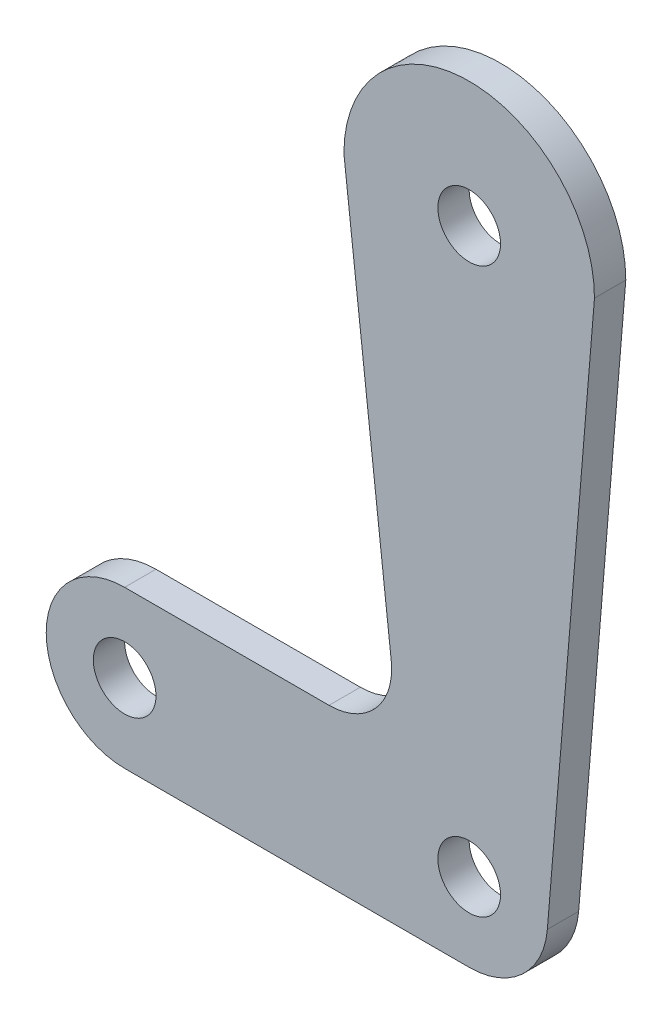
ISO-10303-21;
HEADER;
FILE_DESCRIPTION(('STEP AP214'),'2;1');
FILE_NAME('part.step','',(''),(''),'','','');
FILE_SCHEMA(('AUTOMOTIVE_DESIGN { 1 0 10303 214 1 1 1 1 }'));
ENDSEC;
DATA;
#1=APPLICATION_CONTEXT('core data for automotive mechanical design processes');
#2=APPLICATION_PROTOCOL_DEFINITION('international standard','automotive_design',2000,#1);
#3=PRODUCT_CONTEXT('',#1,'mechanical');
#4=PRODUCT('Part','Part','',(#3));
#5=PRODUCT_RELATED_PRODUCT_CATEGORY('part','',(#4));
#6=PRODUCT_DEFINITION_FORMATION('','',#4);
#7=PRODUCT_DEFINITION_CONTEXT('part definition',#1,'design');
#8=PRODUCT_DEFINITION('design','',#6,#7);
#9=PRODUCT_DEFINITION_SHAPE('','',#8);
#10=(LENGTH_UNIT() NAMED_UNIT(*) SI_UNIT(.MILLI.,.METRE.));
#11=(NAMED_UNIT(*) PLANE_ANGLE_UNIT() SI_UNIT($,.RADIAN.));
#12=(NAMED_UNIT(*) SI_UNIT($,.STERADIAN.) SOLID_ANGLE_UNIT());
#13=UNCERTAINTY_MEASURE_WITH_UNIT(LENGTH_MEASURE(1.E-05),#10,'distance_accuracy_value','');
#14=(GEOMETRIC_REPRESENTATION_CONTEXT(3) GLOBAL_UNCERTAINTY_ASSIGNED_CONTEXT((#13)) GLOBAL_UNIT_ASSIGNED_CONTEXT((#10,
#11,#12)) REPRESENTATION_CONTEXT('',''));
#15=CARTESIAN_POINT('',(0.,0.,0.));
#16=DIRECTION('',(0.,0.,1.));
#17=DIRECTION('',(1.,0.,0.));
#18=AXIS2_PLACEMENT_3D('',#15,#16,#17);
#19=CARTESIAN_POINT('',(28.3681637228015,3.23214399015787,3.175));
#20=DIRECTION('',(0.993571855676588,0.1132032137679,0.));
#21=DIRECTION('',(-0.1132032137679,0.993571855676588,0.));
#22=AXIS2_PLACEMENT_3D('',#19,#20,#21);
#23=PLANE('',#22);
#24=DIRECTION('',(0.1132032137679,-0.993571855676588,0.));
#25=VECTOR('',#24,1.);
#26=CARTESIAN_POINT('',(28.3681637228015,3.23214399015787,0.));
#27=LINE('',#26,#25);
#28=CARTESIAN_POINT('',(22.225,57.15,0.));
#29=VERTEX_POINT('',#28);
#30=CARTESIAN_POINT('',(27.0252165095117,15.0190404074262,0.));
#31=VERTEX_POINT('',#30);
#32=EDGE_CURVE('E154',#29,#31,#27,.T.);
#33=ORIENTED_EDGE('',*,*,#32,.T.);
#34=DIRECTION('',(0.,0.,-1.));
#35=VECTOR('',#34,1.);
#36=CARTESIAN_POINT('',(27.0252165095117,15.0190404074262,3.175));
#37=LINE('',#36,#35);
#38=CARTESIAN_POINT('',(27.0252165095117,15.0190404074262,3.175));
#39=VERTEX_POINT('',#38);
#40=EDGE_CURVE('E11',#39,#31,#37,.T.);
#41=ORIENTED_EDGE('',*,*,#40,.F.);
#42=DIRECTION('',(0.1132032137679,-0.993571855676588,0.));
#43=VECTOR('',#42,1.);
#44=CARTESIAN_POINT('',(28.3681637228015,3.23214399015787,3.175));
#45=LINE('',#44,#43);
#46=CARTESIAN_POINT('',(22.225,57.15,3.175));
#47=VERTEX_POINT('',#46);
#48=EDGE_CURVE('E221',#47,#39,#45,.T.);
#49=ORIENTED_EDGE('',*,*,#48,.F.);
#50=DIRECTION('',(0.,0.,-1.));
#51=VECTOR('',#50,1.);
#52=CARTESIAN_POINT('',(22.225,57.15,3.175));
#53=LINE('',#52,#51);
#54=EDGE_CURVE('E138',#47,#29,#53,.T.);
#55=ORIENTED_EDGE('',*,*,#54,.T.);
#56=EDGE_LOOP('',(#33,#41,#49,#55));
#57=FACE_BOUND('',#56,.T.);
#58=ADVANCED_FACE('F41',(#57),#23,.F.);
#59=CARTESIAN_POINT('',(20.7160352259653,14.3002,3.175));
#60=DIRECTION('',(0.,0.,-1.));
#61=DIRECTION('',(-1.,0.,0.));
#62=AXIS2_PLACEMENT_3D('',#59,#60,#61);
#63=CYLINDRICAL_SURFACE('',#62,6.35);
#64=CARTESIAN_POINT('',(20.7160352259653,14.3002,0.));
#65=DIRECTION('',(0.,0.,1.));
#66=DIRECTION('',(1.,0.,0.));
#67=AXIS2_PLACEMENT_3D('',#64,#65,#66);
#68=CIRCLE('',#67,6.35);
#69=CARTESIAN_POINT('',(20.7160352259653,7.95019999999999,0.));
#70=VERTEX_POINT('',#69);
#71=EDGE_CURVE('E158',#31,#70,#68,.F.);
#72=ORIENTED_EDGE('',*,*,#71,.T.);
#73=DIRECTION('',(0.,0.,-1.));
#74=VECTOR('',#73,1.);
#75=CARTESIAN_POINT('',(20.7160352259653,7.95019999999999,3.175));
#76=LINE('',#75,#74);
#77=CARTESIAN_POINT('',(20.7160352259653,7.95019999999999,3.175));
#78=VERTEX_POINT('',#77);
#79=EDGE_CURVE('E51',#78,#70,#76,.T.);
#80=ORIENTED_EDGE('',*,*,#79,.F.);
#81=CARTESIAN_POINT('',(20.7160352259653,14.3002,3.175));
#82=DIRECTION('',(0.,0.,1.));
#83=DIRECTION('',(1.,0.,0.));
#84=AXIS2_PLACEMENT_3D('',#81,#82,#83);
#85=CIRCLE('',#84,6.35);
#86=EDGE_CURVE('E98',#39,#78,#85,.F.);
#87=ORIENTED_EDGE('',*,*,#86,.F.);
#88=ORIENTED_EDGE('',*,*,#40,.T.);
#89=EDGE_LOOP('',(#72,#80,#87,#88));
#90=FACE_BOUND('',#89,.T.);
#91=ADVANCED_FACE('F199',(#90),#63,.F.);
#92=CARTESIAN_POINT('',(0.,7.95019999999999,3.175));
#93=DIRECTION('',(0.,1.,0.));
#94=DIRECTION('',(0.,0.,1.));
#95=AXIS2_PLACEMENT_3D('',#92,#93,#94);
#96=PLANE('',#95);
#97=DIRECTION('',(1.,0.,0.));
#98=VECTOR('',#97,1.);
#99=CARTESIAN_POINT('',(0.,7.95019999999999,0.));
#100=LINE('',#99,#98);
#101=CARTESIAN_POINT('',(0.,7.95019999999999,0.));
#102=VERTEX_POINT('',#101);
#103=EDGE_CURVE('E162',#102,#70,#100,.T.);
#104=ORIENTED_EDGE('',*,*,#103,.F.);
#105=DIRECTION('',(0.,0.,-1.));
#106=VECTOR('',#105,1.);
#107=CARTESIAN_POINT('',(0.,7.95019999999999,3.175));
#108=LINE('',#107,#106);
#109=CARTESIAN_POINT('',(0.,7.95019999999999,3.175));
#110=VERTEX_POINT('',#109);
#111=EDGE_CURVE('E190',#110,#102,#108,.T.);
#112=ORIENTED_EDGE('',*,*,#111,.F.);
#113=DIRECTION('',(1.,0.,0.));
#114=VECTOR('',#113,1.);
#115=CARTESIAN_POINT('',(0.,7.95019999999999,3.175));
#116=LINE('',#115,#114);
#117=EDGE_CURVE('E198',#110,#78,#116,.T.);
#118=ORIENTED_EDGE('',*,*,#117,.T.);
#119=ORIENTED_EDGE('',*,*,#79,.T.);
#120=EDGE_LOOP('',(#104,#112,#118,#119));
#121=FACE_BOUND('',#120,.T.);
#122=ADVANCED_FACE('F196',(#121),#96,.T.);
#123=CARTESIAN_POINT('',(0.,0.,3.175));
#124=DIRECTION('',(0.,0.,-1.));
#125=DIRECTION('',(-1.,0.,0.));
#126=AXIS2_PLACEMENT_3D('',#123,#124,#125);
#127=CYLINDRICAL_SURFACE('',#126,7.95019999999999);
#128=CARTESIAN_POINT('',(0.,0.,0.));
#129=DIRECTION('',(0.,0.,1.));
#130=DIRECTION('',(1.,0.,0.));
#131=AXIS2_PLACEMENT_3D('',#128,#129,#130);
#132=CIRCLE('',#131,7.95019999999999);
#133=CARTESIAN_POINT('',(0.,-7.95019999999999,0.));
#134=VERTEX_POINT('',#133);
#135=EDGE_CURVE('E166',#102,#134,#132,.T.);
#136=ORIENTED_EDGE('',*,*,#135,.T.);
#137=DIRECTION('',(0.,0.,-1.));
#138=VECTOR('',#137,1.);
#139=CARTESIAN_POINT('',(0.,-7.95019999999999,3.175));
#140=LINE('',#139,#138);
#141=CARTESIAN_POINT('',(0.,-7.95019999999999,3.175));
#142=VERTEX_POINT('',#141);
#143=EDGE_CURVE('E186',#142,#134,#140,.T.);
#144=ORIENTED_EDGE('',*,*,#143,.F.);
#145=CARTESIAN_POINT('',(0.,0.,3.175));
#146=DIRECTION('',(0.,0.,1.));
#147=DIRECTION('',(1.,0.,0.));
#148=AXIS2_PLACEMENT_3D('',#145,#146,#147);
#149=CIRCLE('',#148,7.95019999999999);
#150=EDGE_CURVE('E213',#110,#142,#149,.T.);
#151=ORIENTED_EDGE('',*,*,#150,.F.);
#152=ORIENTED_EDGE('',*,*,#111,.T.);
#153=EDGE_LOOP('',(#136,#144,#151,#152));
#154=FACE_BOUND('',#153,.T.);
#155=ADVANCED_FACE('F208',(#154),#127,.T.);
#156=CARTESIAN_POINT('',(0.,-7.95019999999999,3.175));
#157=DIRECTION('',(0.,1.,0.));
#158=DIRECTION('',(0.,0.,1.));
#159=AXIS2_PLACEMENT_3D('',#156,#157,#158);
#160=PLANE('',#159);
#161=DIRECTION('',(1.,0.,0.));
#162=VECTOR('',#161,1.);
#163=CARTESIAN_POINT('',(0.,-7.95019999999999,0.));
#164=LINE('',#163,#162);
#165=CARTESIAN_POINT('',(34.925,-7.95019999999999,0.));
#166=VERTEX_POINT('',#165);
#167=EDGE_CURVE('E169',#134,#166,#164,.T.);
#168=ORIENTED_EDGE('',*,*,#167,.T.);
#169=DIRECTION('',(0.,0.,-1.));
#170=VECTOR('',#169,1.);
#171=CARTESIAN_POINT('',(34.925,-7.95019999999999,3.175));
#172=LINE('',#171,#170);
#173=CARTESIAN_POINT('',(34.925,-7.95019999999999,3.175));
#174=VERTEX_POINT('',#173);
#175=EDGE_CURVE('E132',#174,#166,#172,.T.);
#176=ORIENTED_EDGE('',*,*,#175,.F.);
#177=DIRECTION('',(1.,0.,0.));
#178=VECTOR('',#177,1.);
#179=CARTESIAN_POINT('',(0.,-7.95019999999999,3.175));
#180=LINE('',#179,#178);
#181=EDGE_CURVE('E117',#142,#174,#180,.T.);
#182=ORIENTED_EDGE('',*,*,#181,.F.);
#183=ORIENTED_EDGE('',*,*,#143,.T.);
#184=EDGE_LOOP('',(#168,#176,#182,#183));
#185=FACE_BOUND('',#184,.T.);
#186=ADVANCED_FACE('F211',(#185),#160,.F.);
#187=CARTESIAN_POINT('',(34.925,0.,3.175));
#188=DIRECTION('',(0.,0.,-1.));
#189=DIRECTION('',(-1.,0.,0.));
#190=AXIS2_PLACEMENT_3D('',#187,#188,#189);
#191=CYLINDRICAL_SURFACE('',#190,7.9502);
#192=CARTESIAN_POINT('',(34.925,0.,0.));
#193=DIRECTION('',(0.,0.,1.));
#194=DIRECTION('',(1.,0.,0.));
#195=AXIS2_PLACEMENT_3D('',#192,#193,#194);
#196=CIRCLE('',#195,7.9502);
#197=CARTESIAN_POINT('',(42.8481928300498,-0.654748362233284,0.));
#198=VERTEX_POINT('',#197);
#199=EDGE_CURVE('E127',#166,#198,#196,.T.);
#200=ORIENTED_EDGE('',*,*,#199,.T.);
#201=DIRECTION('',(0.,0.,-1.));
#202=VECTOR('',#201,1.);
#203=CARTESIAN_POINT('',(42.8481928300498,-0.654748362233284,3.175));
#204=LINE('',#203,#202);
#205=CARTESIAN_POINT('',(42.8481928300498,-0.654748362233284,3.175));
#206=VERTEX_POINT('',#205);
#207=EDGE_CURVE('E124',#206,#198,#204,.T.);
#208=ORIENTED_EDGE('',*,*,#207,.F.);
#209=CARTESIAN_POINT('',(34.925,0.,3.175));
#210=DIRECTION('',(0.,0.,1.));
#211=DIRECTION('',(1.,0.,0.));
#212=AXIS2_PLACEMENT_3D('',#209,#210,#211);
#213=CIRCLE('',#212,7.9502);
#214=EDGE_CURVE('E111',#174,#206,#213,.T.);
#215=ORIENTED_EDGE('',*,*,#214,.F.);
#216=ORIENTED_EDGE('',*,*,#175,.T.);
#217=EDGE_LOOP('',(#200,#208,#215,#216));
#218=FACE_BOUND('',#217,.T.);
#219=ADVANCED_FACE('F125',(#218),#191,.T.);
#220=CARTESIAN_POINT('',(42.6113124190039,-3.52126820808153,3.175));
#221=DIRECTION('',(0.996602957164577,-0.0823562127032393,0.));
#222=DIRECTION('',(0.0823562127032393,0.996602957164577,0.));
#223=AXIS2_PLACEMENT_3D('',#220,#221,#222);
#224=PLANE('',#223);
#225=DIRECTION('',(-0.0823562127032393,-0.996602957164577,0.));
#226=VECTOR('',#225,1.);
#227=CARTESIAN_POINT('',(42.6113124190039,-3.52126820808153,0.));
#228=LINE('',#227,#226);
#229=CARTESIAN_POINT('',(47.625,57.15,0.));
#230=VERTEX_POINT('',#229);
#231=EDGE_CURVE('E174',#230,#198,#228,.T.);
#232=ORIENTED_EDGE('',*,*,#231,.F.);
#233=DIRECTION('',(0.,0.,-1.));
#234=VECTOR('',#233,1.);
#235=CARTESIAN_POINT('',(47.625,57.15,3.175));
#236=LINE('',#235,#234);
#237=CARTESIAN_POINT('',(47.625,57.15,3.175));
#238=VERTEX_POINT('',#237);
#239=EDGE_CURVE('E87',#238,#230,#236,.T.);
#240=ORIENTED_EDGE('',*,*,#239,.F.);
#241=DIRECTION('',(-0.0823562127032393,-0.996602957164577,0.));
#242=VECTOR('',#241,1.);
#243=CARTESIAN_POINT('',(42.6113124190039,-3.52126820808153,3.175));
#244=LINE('',#243,#242);
#245=EDGE_CURVE('E115',#238,#206,#244,.T.);
#246=ORIENTED_EDGE('',*,*,#245,.T.);
#247=ORIENTED_EDGE('',*,*,#207,.T.);
#248=EDGE_LOOP('',(#232,#240,#246,#247));
#249=FACE_BOUND('',#248,.T.);
#250=ADVANCED_FACE('F134',(#249),#224,.T.);
#251=CARTESIAN_POINT('',(34.925,57.15,3.175));
#252=DIRECTION('',(0.,0.,-1.));
#253=DIRECTION('',(-1.,0.,0.));
#254=AXIS2_PLACEMENT_3D('',#251,#252,#253);
#255=CYLINDRICAL_SURFACE('',#254,3.175);
#256=CARTESIAN_POINT('',(34.925,57.15,3.175));
#257=DIRECTION('',(0.,0.,1.));
#258=DIRECTION('',(1.,0.,0.));
#259=AXIS2_PLACEMENT_3D('',#256,#257,#258);
#260=CIRCLE('',#259,3.175);
#261=CARTESIAN_POINT('',(38.1,57.15,3.175));
#262=VERTEX_POINT('',#261);
#263=EDGE_CURVE('E224',#262,#262,#260,.T.);
#264=ORIENTED_EDGE('',*,*,#263,.T.);
#265=EDGE_LOOP('',(#264));
#266=FACE_BOUND('',#265,.T.);
#267=CARTESIAN_POINT('',(34.925,57.15,0.));
#268=DIRECTION('',(0.,0.,1.));
#269=DIRECTION('',(1.,0.,0.));
#270=AXIS2_PLACEMENT_3D('',#267,#268,#269);
#271=CIRCLE('',#270,3.175);
#272=CARTESIAN_POINT('',(38.1,57.15,0.));
#273=VERTEX_POINT('',#272);
#274=EDGE_CURVE('E150',#273,#273,#271,.T.);
#275=ORIENTED_EDGE('',*,*,#274,.F.);
#276=EDGE_LOOP('',(#275));
#277=FACE_BOUND('',#276,.T.);
#278=ADVANCED_FACE('F246',(#266,#277),#255,.F.);
#279=CARTESIAN_POINT('',(34.925,0.,3.175));
#280=DIRECTION('',(0.,0.,-1.));
#281=DIRECTION('',(-1.,0.,0.));
#282=AXIS2_PLACEMENT_3D('',#279,#280,#281);
#283=CYLINDRICAL_SURFACE('',#282,3.175);
#284=CARTESIAN_POINT('',(34.925,0.,3.175));
#285=DIRECTION('',(0.,0.,1.));
#286=DIRECTION('',(1.,0.,0.));
#287=AXIS2_PLACEMENT_3D('',#284,#285,#286);
#288=CIRCLE('',#287,3.175);
#289=CARTESIAN_POINT('',(38.1,0.,3.175));
#290=VERTEX_POINT('',#289);
#291=EDGE_CURVE('E228',#290,#290,#288,.T.);
#292=ORIENTED_EDGE('',*,*,#291,.T.);
#293=EDGE_LOOP('',(#292));
#294=FACE_BOUND('',#293,.T.);
#295=CARTESIAN_POINT('',(34.925,0.,0.));
#296=DIRECTION('',(0.,0.,1.));
#297=DIRECTION('',(1.,0.,0.));
#298=AXIS2_PLACEMENT_3D('',#295,#296,#297);
#299=CIRCLE('',#298,3.175);
#300=CARTESIAN_POINT('',(38.1,0.,0.));
#301=VERTEX_POINT('',#300);
#302=EDGE_CURVE('E146',#301,#301,#299,.T.);
#303=ORIENTED_EDGE('',*,*,#302,.F.);
#304=EDGE_LOOP('',(#303));
#305=FACE_BOUND('',#304,.T.);
#306=ADVANCED_FACE('F249',(#294,#305),#283,.F.);
#307=CARTESIAN_POINT('',(0.,0.,3.175));
#308=DIRECTION('',(0.,0.,-1.));
#309=DIRECTION('',(-1.,0.,0.));
#310=AXIS2_PLACEMENT_3D('',#307,#308,#309);
#311=CYLINDRICAL_SURFACE('',#310,3.175);
#312=CARTESIAN_POINT('',(0.,0.,3.175));
#313=DIRECTION('',(0.,0.,1.));
#314=DIRECTION('',(1.,0.,0.));
#315=AXIS2_PLACEMENT_3D('',#312,#313,#314);
#316=CIRCLE('',#315,3.175);
#317=CARTESIAN_POINT('',(3.175,0.,3.175));
#318=VERTEX_POINT('',#317);
#319=EDGE_CURVE('E179',#318,#318,#316,.T.);
#320=ORIENTED_EDGE('',*,*,#319,.T.);
#321=EDGE_LOOP('',(#320));
#322=FACE_BOUND('',#321,.T.);
#323=CARTESIAN_POINT('',(0.,0.,0.));
#324=DIRECTION('',(0.,0.,1.));
#325=DIRECTION('',(1.,0.,0.));
#326=AXIS2_PLACEMENT_3D('',#323,#324,#325);
#327=CIRCLE('',#326,3.175);
#328=CARTESIAN_POINT('',(3.175,0.,0.));
#329=VERTEX_POINT('',#328);
#330=EDGE_CURVE('E142',#329,#329,#327,.T.);
#331=ORIENTED_EDGE('',*,*,#330,.F.);
#332=EDGE_LOOP('',(#331));
#333=FACE_BOUND('',#332,.T.);
#334=ADVANCED_FACE('F43',(#322,#333),#311,.F.);
#335=CARTESIAN_POINT('',(34.925,57.15,3.175));
#336=DIRECTION('',(0.,0.,-1.));
#337=DIRECTION('',(-1.,0.,0.));
#338=AXIS2_PLACEMENT_3D('',#335,#336,#337);
#339=CYLINDRICAL_SURFACE('',#338,12.7);
#340=CARTESIAN_POINT('',(34.925,57.15,0.));
#341=DIRECTION('',(0.,0.,1.));
#342=DIRECTION('',(1.,0.,0.));
#343=AXIS2_PLACEMENT_3D('',#340,#341,#342);
#344=CIRCLE('',#343,12.7);
#345=EDGE_CURVE('E90',#230,#29,#344,.T.);
#346=ORIENTED_EDGE('',*,*,#345,.T.);
#347=ORIENTED_EDGE('',*,*,#54,.F.);
#348=CARTESIAN_POINT('',(34.925,57.15,3.175));
#349=DIRECTION('',(0.,0.,1.));
#350=DIRECTION('',(1.,0.,0.));
#351=AXIS2_PLACEMENT_3D('',#348,#349,#350);
#352=CIRCLE('',#351,12.7);
#353=EDGE_CURVE('E59',#238,#47,#352,.T.);
#354=ORIENTED_EDGE('',*,*,#353,.F.);
#355=ORIENTED_EDGE('',*,*,#239,.T.);
#356=EDGE_LOOP('',(#346,#347,#354,#355));
#357=FACE_BOUND('',#356,.T.);
#358=ADVANCED_FACE('F240',(#357),#339,.T.);
#359=CARTESIAN_POINT('',(0.,0.,3.175));
#360=DIRECTION('',(0.,0.,1.));
#361=DIRECTION('',(1.,0.,0.));
#362=AXIS2_PLACEMENT_3D('',#359,#360,#361);
#363=PLANE('',#362);
#364=ORIENTED_EDGE('',*,*,#319,.F.);
#365=EDGE_LOOP('',(#364));
#366=FACE_BOUND('',#365,.T.);
#367=ORIENTED_EDGE('',*,*,#291,.F.);
#368=EDGE_LOOP('',(#367));
#369=FACE_BOUND('',#368,.T.);
#370=ORIENTED_EDGE('',*,*,#263,.F.);
#371=EDGE_LOOP('',(#370));
#372=FACE_BOUND('',#371,.T.);
#373=ORIENTED_EDGE('',*,*,#48,.T.);
#374=ORIENTED_EDGE('',*,*,#86,.T.);
#375=ORIENTED_EDGE('',*,*,#117,.F.);
#376=ORIENTED_EDGE('',*,*,#150,.T.);
#377=ORIENTED_EDGE('',*,*,#181,.T.);
#378=ORIENTED_EDGE('',*,*,#214,.T.);
#379=ORIENTED_EDGE('',*,*,#245,.F.);
#380=ORIENTED_EDGE('',*,*,#353,.T.);
#381=EDGE_LOOP('',(#373,#374,#375,#376,#377,#378,#379,#380));
#382=FACE_BOUND('',#381,.T.);
#383=ADVANCED_FACE('F113',(#366,#369,#372,#382),#363,.T.);
#384=CARTESIAN_POINT('',(0.,0.,0.));
#385=DIRECTION('',(0.,0.,1.));
#386=DIRECTION('',(1.,0.,0.));
#387=AXIS2_PLACEMENT_3D('',#384,#385,#386);
#388=PLANE('',#387);
#389=ORIENTED_EDGE('',*,*,#330,.T.);
#390=EDGE_LOOP('',(#389));
#391=FACE_BOUND('',#390,.T.);
#392=ORIENTED_EDGE('',*,*,#302,.T.);
#393=EDGE_LOOP('',(#392));
#394=FACE_BOUND('',#393,.T.);
#395=ORIENTED_EDGE('',*,*,#274,.T.);
#396=EDGE_LOOP('',(#395));
#397=FACE_BOUND('',#396,.T.);
#398=ORIENTED_EDGE('',*,*,#32,.F.);
#399=ORIENTED_EDGE('',*,*,#345,.F.);
#400=ORIENTED_EDGE('',*,*,#231,.T.);
#401=ORIENTED_EDGE('',*,*,#199,.F.);
#402=ORIENTED_EDGE('',*,*,#167,.F.);
#403=ORIENTED_EDGE('',*,*,#135,.F.);
#404=ORIENTED_EDGE('',*,*,#103,.T.);
#405=ORIENTED_EDGE('',*,*,#71,.F.);
#406=EDGE_LOOP('',(#398,#399,#400,#401,#402,#403,#404,#405));
#407=FACE_BOUND('',#406,.T.);
#408=ADVANCED_FACE('F204',(#391,#394,#397,#407),#388,.F.);
#409=CLOSED_SHELL('',(#58,#91,#122,#155,#186,#219,#250,#278,#306,#334,#358,#383,#408));
#410=MANIFOLD_SOLID_BREP('B2',#409);
#411=ADVANCED_BREP_SHAPE_REPRESENTATION('',(#18,#410),#14);
#412=SHAPE_DEFINITION_REPRESENTATION(#9,#411);
ENDSEC;
END-ISO-10303-21;
